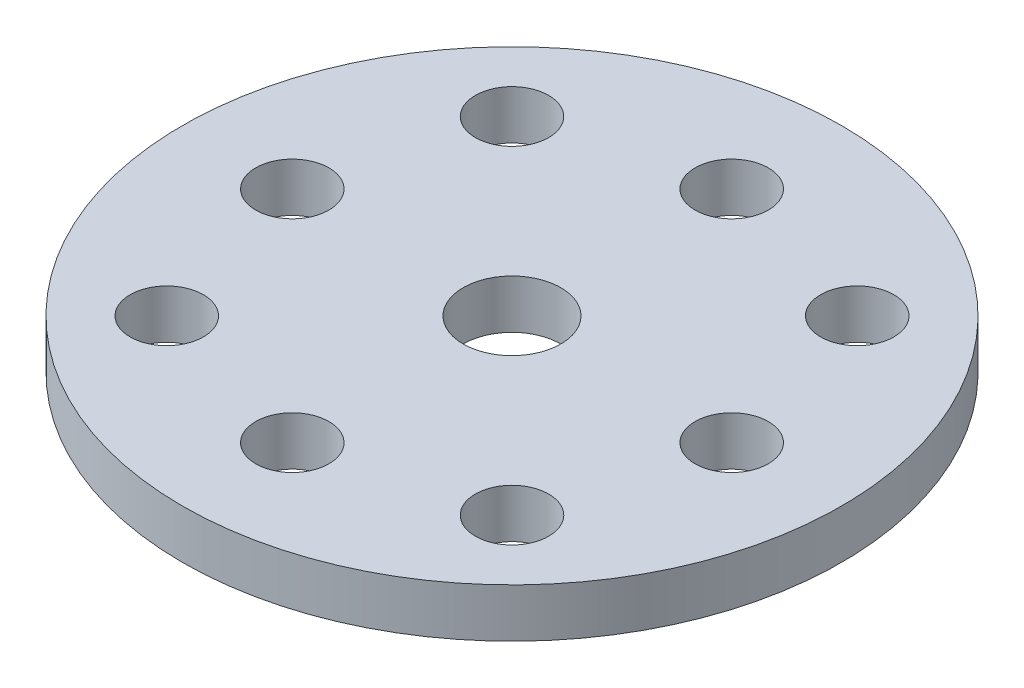
ISO-10303-21;
HEADER;
FILE_DESCRIPTION(('STEP AP214'),'2;1');
FILE_NAME('part.step','',(''),(''),'','','');
FILE_SCHEMA(('AUTOMOTIVE_DESIGN { 1 0 10303 214 1 1 1 1 }'));
ENDSEC;
DATA;
#1=APPLICATION_CONTEXT('core data for automotive mechanical design processes');
#2=APPLICATION_PROTOCOL_DEFINITION('international standard','automotive_design',2000,#1);
#3=PRODUCT_CONTEXT('',#1,'mechanical');
#4=PRODUCT('Part','Part','',(#3));
#5=PRODUCT_RELATED_PRODUCT_CATEGORY('part','',(#4));
#6=PRODUCT_DEFINITION_FORMATION('','',#4);
#7=PRODUCT_DEFINITION_CONTEXT('part definition',#1,'design');
#8=PRODUCT_DEFINITION('design','',#6,#7);
#9=PRODUCT_DEFINITION_SHAPE('','',#8);
#10=(LENGTH_UNIT() NAMED_UNIT(*) SI_UNIT(.MILLI.,.METRE.));
#11=(NAMED_UNIT(*) PLANE_ANGLE_UNIT() SI_UNIT($,.RADIAN.));
#12=(NAMED_UNIT(*) SI_UNIT($,.STERADIAN.) SOLID_ANGLE_UNIT());
#13=UNCERTAINTY_MEASURE_WITH_UNIT(LENGTH_MEASURE(1.E-05),#10,'distance_accuracy_value','');
#14=(GEOMETRIC_REPRESENTATION_CONTEXT(3) GLOBAL_UNCERTAINTY_ASSIGNED_CONTEXT((#13)) GLOBAL_UNIT_ASSIGNED_CONTEXT((#10,
#11,#12)) REPRESENTATION_CONTEXT('',''));
#15=CARTESIAN_POINT('',(0.,0.,0.));
#16=DIRECTION('',(0.,0.,1.));
#17=DIRECTION('',(1.,0.,0.));
#18=AXIS2_PLACEMENT_3D('',#15,#16,#17);
#19=CARTESIAN_POINT('',(0.,2.,0.));
#20=DIRECTION('',(0.,-1.,0.));
#21=DIRECTION('',(0.,0.,-1.));
#22=AXIS2_PLACEMENT_3D('',#19,#20,#21);
#23=CYLINDRICAL_SURFACE('',#22,13.5);
#24=CARTESIAN_POINT('',(0.,2.,0.));
#25=DIRECTION('',(0.,1.,0.));
#26=DIRECTION('',(0.,0.,1.));
#27=AXIS2_PLACEMENT_3D('',#24,#25,#26);
#28=CIRCLE('',#27,13.5);
#29=CARTESIAN_POINT('',(0.,2.,13.5));
#30=VERTEX_POINT('',#29);
#31=EDGE_CURVE('E10',#30,#30,#28,.T.);
#32=ORIENTED_EDGE('',*,*,#31,.F.);
#33=EDGE_LOOP('',(#32));
#34=FACE_BOUND('',#33,.T.);
#35=CARTESIAN_POINT('',(0.,0.,0.));
#36=DIRECTION('',(0.,1.,0.));
#37=DIRECTION('',(0.,0.,1.));
#38=AXIS2_PLACEMENT_3D('',#35,#36,#37);
#39=CIRCLE('',#38,13.5);
#40=CARTESIAN_POINT('',(0.,0.,13.5));
#41=VERTEX_POINT('',#40);
#42=EDGE_CURVE('E36',#41,#41,#39,.T.);
#43=ORIENTED_EDGE('',*,*,#42,.T.);
#44=EDGE_LOOP('',(#43));
#45=FACE_BOUND('',#44,.T.);
#46=ADVANCED_FACE('F33',(#34,#45),#23,.T.);
#47=CARTESIAN_POINT('',(0.,2.,0.));
#48=DIRECTION('',(0.,1.,0.));
#49=DIRECTION('',(0.,0.,1.));
#50=AXIS2_PLACEMENT_3D('',#47,#48,#49);
#51=PLANE('',#50);
#52=CARTESIAN_POINT('',(0.,2.,0.));
#53=DIRECTION('',(0.,1.,0.));
#54=DIRECTION('',(0.,0.,1.));
#55=AXIS2_PLACEMENT_3D('',#52,#53,#54);
#56=CIRCLE('',#55,2.);
#57=CARTESIAN_POINT('',(0.,2.,2.));
#58=VERTEX_POINT('',#57);
#59=EDGE_CURVE('E93',#58,#58,#56,.T.);
#60=ORIENTED_EDGE('',*,*,#59,.F.);
#61=EDGE_LOOP('',(#60));
#62=FACE_BOUND('',#61,.T.);
#63=CARTESIAN_POINT('',(-7.07106781186556,2.,7.07106781186539));
#64=DIRECTION('',(0.,-1.,0.));
#65=DIRECTION('',(-1.,0.,0.));
#66=AXIS2_PLACEMENT_3D('',#63,#64,#65);
#67=CIRCLE('',#66,1.5);
#68=CARTESIAN_POINT('',(-8.57106781186556,2.,7.07106781186537));
#69=VERTEX_POINT('',#68);
#70=EDGE_CURVE('E78',#69,#69,#67,.T.);
#71=ORIENTED_EDGE('',*,*,#70,.T.);
#72=EDGE_LOOP('',(#71));
#73=FACE_BOUND('',#72,.T.);
#74=CARTESIAN_POINT('',(9.,2.,0.));
#75=DIRECTION('',(0.,-1.,0.));
#76=DIRECTION('',(0.,0.,1.));
#77=AXIS2_PLACEMENT_3D('',#74,#75,#76);
#78=CIRCLE('',#77,1.5);
#79=CARTESIAN_POINT('',(9.,2.,1.5));
#80=VERTEX_POINT('',#79);
#81=EDGE_CURVE('E67',#80,#80,#78,.T.);
#82=ORIENTED_EDGE('',*,*,#81,.T.);
#83=EDGE_LOOP('',(#82));
#84=FACE_BOUND('',#83,.T.);
#85=CARTESIAN_POINT('',(7.07106781186546,2.,7.07106781186549));
#86=DIRECTION('',(0.,-1.,0.));
#87=DIRECTION('',(0.,0.,1.));
#88=AXIS2_PLACEMENT_3D('',#85,#86,#87);
#89=CIRCLE('',#88,1.5);
#90=CARTESIAN_POINT('',(7.07106781186546,2.,8.57106781186549));
#91=VERTEX_POINT('',#90);
#92=EDGE_CURVE('E66',#91,#91,#89,.T.);
#93=ORIENTED_EDGE('',*,*,#92,.T.);
#94=EDGE_LOOP('',(#93));
#95=FACE_BOUND('',#94,.T.);
#96=CARTESIAN_POINT('',(0.,2.,-9.));
#97=DIRECTION('',(0.,-1.,0.));
#98=DIRECTION('',(1.,0.,0.));
#99=AXIS2_PLACEMENT_3D('',#96,#97,#98);
#100=CIRCLE('',#99,1.5);
#101=CARTESIAN_POINT('',(1.50000000000003,2.,-8.99999999999999));
#102=VERTEX_POINT('',#101);
#103=EDGE_CURVE('E60',#102,#102,#100,.T.);
#104=ORIENTED_EDGE('',*,*,#103,.T.);
#105=EDGE_LOOP('',(#104));
#106=FACE_BOUND('',#105,.T.);
#107=CARTESIAN_POINT('',(0.,2.,9.));
#108=DIRECTION('',(0.,-1.,0.));
#109=DIRECTION('',(-1.,0.,0.));
#110=AXIS2_PLACEMENT_3D('',#107,#108,#109);
#111=CIRCLE('',#110,1.5);
#112=CARTESIAN_POINT('',(-1.50000000000009,2.,8.99999999999998));
#113=VERTEX_POINT('',#112);
#114=EDGE_CURVE('E79',#113,#113,#111,.T.);
#115=ORIENTED_EDGE('',*,*,#114,.T.);
#116=EDGE_LOOP('',(#115));
#117=FACE_BOUND('',#116,.T.);
#118=CARTESIAN_POINT('',(7.07106781186551,2.,-7.07106781186544));
#119=DIRECTION('',(0.,-1.,0.));
#120=DIRECTION('',(1.,0.,0.));
#121=AXIS2_PLACEMENT_3D('',#118,#119,#120);
#122=CIRCLE('',#121,1.5);
#123=CARTESIAN_POINT('',(8.57106781186551,2.,-7.07106781186543));
#124=VERTEX_POINT('',#123);
#125=EDGE_CURVE('E49',#124,#124,#122,.T.);
#126=ORIENTED_EDGE('',*,*,#125,.T.);
#127=EDGE_LOOP('',(#126));
#128=FACE_BOUND('',#127,.T.);
#129=CARTESIAN_POINT('',(-7.07106781186546,2.,-7.07106781186549));
#130=DIRECTION('',(0.,-1.,0.));
#131=DIRECTION('',(0.,0.,-1.));
#132=AXIS2_PLACEMENT_3D('',#129,#130,#131);
#133=CIRCLE('',#132,1.5);
#134=CARTESIAN_POINT('',(-7.07106781186546,2.,-8.57106781186549));
#135=VERTEX_POINT('',#134);
#136=EDGE_CURVE('E43',#135,#135,#133,.T.);
#137=ORIENTED_EDGE('',*,*,#136,.T.);
#138=EDGE_LOOP('',(#137));
#139=FACE_BOUND('',#138,.T.);
#140=CARTESIAN_POINT('',(-9.,2.,0.));
#141=DIRECTION('',(0.,-1.,0.));
#142=DIRECTION('',(0.,0.,-1.));
#143=AXIS2_PLACEMENT_3D('',#140,#141,#142);
#144=CIRCLE('',#143,1.5);
#145=CARTESIAN_POINT('',(-9.,2.,-1.5));
#146=VERTEX_POINT('',#145);
#147=EDGE_CURVE('E48',#146,#146,#144,.T.);
#148=ORIENTED_EDGE('',*,*,#147,.T.);
#149=EDGE_LOOP('',(#148));
#150=FACE_BOUND('',#149,.T.);
#151=ORIENTED_EDGE('',*,*,#31,.T.);
#152=EDGE_LOOP('',(#151));
#153=FACE_BOUND('',#152,.T.);
#154=ADVANCED_FACE('F109',(#62,#73,#84,#95,#106,#117,#128,#139,#150,#153),#51,.T.);
#155=CARTESIAN_POINT('',(0.,0.,0.));
#156=DIRECTION('',(0.,1.,0.));
#157=DIRECTION('',(0.,0.,1.));
#158=AXIS2_PLACEMENT_3D('',#155,#156,#157);
#159=PLANE('',#158);
#160=CARTESIAN_POINT('',(0.,0.,0.));
#161=DIRECTION('',(0.,1.,0.));
#162=DIRECTION('',(0.,0.,1.));
#163=AXIS2_PLACEMENT_3D('',#160,#161,#162);
#164=CIRCLE('',#163,2.);
#165=CARTESIAN_POINT('',(0.,0.,2.));
#166=VERTEX_POINT('',#165);
#167=EDGE_CURVE('E90',#166,#166,#164,.T.);
#168=ORIENTED_EDGE('',*,*,#167,.T.);
#169=EDGE_LOOP('',(#168));
#170=FACE_BOUND('',#169,.T.);
#171=CARTESIAN_POINT('',(-7.07106781186556,0.,7.07106781186539));
#172=DIRECTION('',(0.,-1.,0.));
#173=DIRECTION('',(-1.,0.,0.));
#174=AXIS2_PLACEMENT_3D('',#171,#172,#173);
#175=CIRCLE('',#174,1.5);
#176=CARTESIAN_POINT('',(-8.57106781186556,0.,7.07106781186537));
#177=VERTEX_POINT('',#176);
#178=EDGE_CURVE('E75',#177,#177,#175,.T.);
#179=ORIENTED_EDGE('',*,*,#178,.F.);
#180=EDGE_LOOP('',(#179));
#181=FACE_BOUND('',#180,.T.);
#182=CARTESIAN_POINT('',(9.,0.,0.));
#183=DIRECTION('',(0.,-1.,0.));
#184=DIRECTION('',(0.,0.,1.));
#185=AXIS2_PLACEMENT_3D('',#182,#183,#184);
#186=CIRCLE('',#185,1.5);
#187=CARTESIAN_POINT('',(9.,0.,1.5));
#188=VERTEX_POINT('',#187);
#189=EDGE_CURVE('E82',#188,#188,#186,.T.);
#190=ORIENTED_EDGE('',*,*,#189,.F.);
#191=EDGE_LOOP('',(#190));
#192=FACE_BOUND('',#191,.T.);
#193=CARTESIAN_POINT('',(7.07106781186546,0.,7.07106781186549));
#194=DIRECTION('',(0.,-1.,0.));
#195=DIRECTION('',(0.,0.,1.));
#196=AXIS2_PLACEMENT_3D('',#193,#194,#195);
#197=CIRCLE('',#196,1.5);
#198=CARTESIAN_POINT('',(7.07106781186546,0.,8.57106781186549));
#199=VERTEX_POINT('',#198);
#200=EDGE_CURVE('E63',#199,#199,#197,.T.);
#201=ORIENTED_EDGE('',*,*,#200,.F.);
#202=EDGE_LOOP('',(#201));
#203=FACE_BOUND('',#202,.T.);
#204=CARTESIAN_POINT('',(0.,0.,-9.));
#205=DIRECTION('',(0.,-1.,0.));
#206=DIRECTION('',(1.,0.,0.));
#207=AXIS2_PLACEMENT_3D('',#204,#205,#206);
#208=CIRCLE('',#207,1.5);
#209=CARTESIAN_POINT('',(1.50000000000003,0.,-8.99999999999999));
#210=VERTEX_POINT('',#209);
#211=EDGE_CURVE('E70',#210,#210,#208,.T.);
#212=ORIENTED_EDGE('',*,*,#211,.F.);
#213=EDGE_LOOP('',(#212));
#214=FACE_BOUND('',#213,.T.);
#215=CARTESIAN_POINT('',(0.,0.,9.));
#216=DIRECTION('',(0.,-1.,0.));
#217=DIRECTION('',(-1.,0.,0.));
#218=AXIS2_PLACEMENT_3D('',#215,#216,#217);
#219=CIRCLE('',#218,1.5);
#220=CARTESIAN_POINT('',(-1.50000000000009,0.,8.99999999999998));
#221=VERTEX_POINT('',#220);
#222=EDGE_CURVE('E87',#221,#221,#219,.T.);
#223=ORIENTED_EDGE('',*,*,#222,.F.);
#224=EDGE_LOOP('',(#223));
#225=FACE_BOUND('',#224,.T.);
#226=CARTESIAN_POINT('',(7.07106781186551,0.,-7.07106781186544));
#227=DIRECTION('',(0.,-1.,0.));
#228=DIRECTION('',(1.,0.,0.));
#229=AXIS2_PLACEMENT_3D('',#226,#227,#228);
#230=CIRCLE('',#229,1.5);
#231=CARTESIAN_POINT('',(8.57106781186551,0.,-7.07106781186543));
#232=VERTEX_POINT('',#231);
#233=EDGE_CURVE('E57',#232,#232,#230,.T.);
#234=ORIENTED_EDGE('',*,*,#233,.F.);
#235=EDGE_LOOP('',(#234));
#236=FACE_BOUND('',#235,.T.);
#237=CARTESIAN_POINT('',(-7.07106781186546,0.,-7.07106781186549));
#238=DIRECTION('',(0.,-1.,0.));
#239=DIRECTION('',(0.,0.,-1.));
#240=AXIS2_PLACEMENT_3D('',#237,#238,#239);
#241=CIRCLE('',#240,1.5);
#242=CARTESIAN_POINT('',(-7.07106781186546,0.,-8.57106781186549));
#243=VERTEX_POINT('',#242);
#244=EDGE_CURVE('E52',#243,#243,#241,.T.);
#245=ORIENTED_EDGE('',*,*,#244,.F.);
#246=EDGE_LOOP('',(#245));
#247=FACE_BOUND('',#246,.T.);
#248=CARTESIAN_POINT('',(-9.,0.,0.));
#249=DIRECTION('',(0.,-1.,0.));
#250=DIRECTION('',(0.,0.,-1.));
#251=AXIS2_PLACEMENT_3D('',#248,#249,#250);
#252=CIRCLE('',#251,1.5);
#253=CARTESIAN_POINT('',(-9.,0.,-1.5));
#254=VERTEX_POINT('',#253);
#255=EDGE_CURVE('E45',#254,#254,#252,.T.);
#256=ORIENTED_EDGE('',*,*,#255,.F.);
#257=EDGE_LOOP('',(#256));
#258=FACE_BOUND('',#257,.T.);
#259=ORIENTED_EDGE('',*,*,#42,.F.);
#260=EDGE_LOOP('',(#259));
#261=FACE_BOUND('',#260,.T.);
#262=ADVANCED_FACE('F99',(#170,#181,#192,#203,#214,#225,#236,#247,#258,#261),#159,.F.);
#263=CARTESIAN_POINT('',(-9.,2.,0.));
#264=DIRECTION('',(0.,-1.,0.));
#265=DIRECTION('',(0.,0.,-1.));
#266=AXIS2_PLACEMENT_3D('',#263,#264,#265);
#267=CYLINDRICAL_SURFACE('',#266,1.5);
#268=ORIENTED_EDGE('',*,*,#147,.F.);
#269=EDGE_LOOP('',(#268));
#270=FACE_BOUND('',#269,.T.);
#271=ORIENTED_EDGE('',*,*,#255,.T.);
#272=EDGE_LOOP('',(#271));
#273=FACE_BOUND('',#272,.T.);
#274=ADVANCED_FACE('F129',(#270,#273),#267,.F.);
#275=CARTESIAN_POINT('',(-7.07106781186546,2.,-7.07106781186549));
#276=DIRECTION('',(0.,-1.,0.));
#277=DIRECTION('',(0.,0.,-1.));
#278=AXIS2_PLACEMENT_3D('',#275,#276,#277);
#279=CYLINDRICAL_SURFACE('',#278,1.5);
#280=ORIENTED_EDGE('',*,*,#136,.F.);
#281=EDGE_LOOP('',(#280));
#282=FACE_BOUND('',#281,.T.);
#283=ORIENTED_EDGE('',*,*,#244,.T.);
#284=EDGE_LOOP('',(#283));
#285=FACE_BOUND('',#284,.T.);
#286=ADVANCED_FACE('F132',(#282,#285),#279,.F.);
#287=CARTESIAN_POINT('',(7.07106781186551,2.,-7.07106781186544));
#288=DIRECTION('',(0.,-1.,0.));
#289=DIRECTION('',(0.,0.,-1.));
#290=AXIS2_PLACEMENT_3D('',#287,#288,#289);
#291=CYLINDRICAL_SURFACE('',#290,1.5);
#292=ORIENTED_EDGE('',*,*,#125,.F.);
#293=EDGE_LOOP('',(#292));
#294=FACE_BOUND('',#293,.T.);
#295=ORIENTED_EDGE('',*,*,#233,.T.);
#296=EDGE_LOOP('',(#295));
#297=FACE_BOUND('',#296,.T.);
#298=ADVANCED_FACE('F164',(#294,#297),#291,.F.);
#299=CARTESIAN_POINT('',(0.,2.,9.));
#300=DIRECTION('',(0.,-1.,0.));
#301=DIRECTION('',(0.,0.,-1.));
#302=AXIS2_PLACEMENT_3D('',#299,#300,#301);
#303=CYLINDRICAL_SURFACE('',#302,1.5);
#304=ORIENTED_EDGE('',*,*,#114,.F.);
#305=EDGE_LOOP('',(#304));
#306=FACE_BOUND('',#305,.T.);
#307=ORIENTED_EDGE('',*,*,#222,.T.);
#308=EDGE_LOOP('',(#307));
#309=FACE_BOUND('',#308,.T.);
#310=ADVANCED_FACE('F172',(#306,#309),#303,.F.);
#311=CARTESIAN_POINT('',(0.,2.,-9.));
#312=DIRECTION('',(0.,-1.,0.));
#313=DIRECTION('',(0.,0.,-1.));
#314=AXIS2_PLACEMENT_3D('',#311,#312,#313);
#315=CYLINDRICAL_SURFACE('',#314,1.5);
#316=ORIENTED_EDGE('',*,*,#103,.F.);
#317=EDGE_LOOP('',(#316));
#318=FACE_BOUND('',#317,.T.);
#319=ORIENTED_EDGE('',*,*,#211,.T.);
#320=EDGE_LOOP('',(#319));
#321=FACE_BOUND('',#320,.T.);
#322=ADVANCED_FACE('F180',(#318,#321),#315,.F.);
#323=CARTESIAN_POINT('',(7.07106781186546,2.,7.07106781186549));
#324=DIRECTION('',(0.,-1.,0.));
#325=DIRECTION('',(0.,0.,-1.));
#326=AXIS2_PLACEMENT_3D('',#323,#324,#325);
#327=CYLINDRICAL_SURFACE('',#326,1.5);
#328=ORIENTED_EDGE('',*,*,#92,.F.);
#329=EDGE_LOOP('',(#328));
#330=FACE_BOUND('',#329,.T.);
#331=ORIENTED_EDGE('',*,*,#200,.T.);
#332=EDGE_LOOP('',(#331));
#333=FACE_BOUND('',#332,.T.);
#334=ADVANCED_FACE('F188',(#330,#333),#327,.F.);
#335=CARTESIAN_POINT('',(9.,2.,0.));
#336=DIRECTION('',(0.,-1.,0.));
#337=DIRECTION('',(0.,0.,-1.));
#338=AXIS2_PLACEMENT_3D('',#335,#336,#337);
#339=CYLINDRICAL_SURFACE('',#338,1.5);
#340=ORIENTED_EDGE('',*,*,#81,.F.);
#341=EDGE_LOOP('',(#340));
#342=FACE_BOUND('',#341,.T.);
#343=ORIENTED_EDGE('',*,*,#189,.T.);
#344=EDGE_LOOP('',(#343));
#345=FACE_BOUND('',#344,.T.);
#346=ADVANCED_FACE('F196',(#342,#345),#339,.F.);
#347=CARTESIAN_POINT('',(-7.07106781186556,2.,7.07106781186539));
#348=DIRECTION('',(0.,-1.,0.));
#349=DIRECTION('',(0.,0.,-1.));
#350=AXIS2_PLACEMENT_3D('',#347,#348,#349);
#351=CYLINDRICAL_SURFACE('',#350,1.5);
#352=ORIENTED_EDGE('',*,*,#70,.F.);
#353=EDGE_LOOP('',(#352));
#354=FACE_BOUND('',#353,.T.);
#355=ORIENTED_EDGE('',*,*,#178,.T.);
#356=EDGE_LOOP('',(#355));
#357=FACE_BOUND('',#356,.T.);
#358=ADVANCED_FACE('F105',(#354,#357),#351,.F.);
#359=CARTESIAN_POINT('',(0.,0.,0.));
#360=DIRECTION('',(0.,1.,0.));
#361=DIRECTION('',(0.,0.,1.));
#362=AXIS2_PLACEMENT_3D('',#359,#360,#361);
#363=CYLINDRICAL_SURFACE('',#362,2.);
#364=ORIENTED_EDGE('',*,*,#167,.F.);
#365=EDGE_LOOP('',(#364));
#366=FACE_BOUND('',#365,.T.);
#367=ORIENTED_EDGE('',*,*,#59,.T.);
#368=EDGE_LOOP('',(#367));
#369=FACE_BOUND('',#368,.T.);
#370=ADVANCED_FACE('F102',(#366,#369),#363,.F.);
#371=CLOSED_SHELL('',(#46,#154,#262,#274,#286,#298,#310,#322,#334,#346,#358,#370));
#372=MANIFOLD_SOLID_BREP('B2',#371);
#373=ADVANCED_BREP_SHAPE_REPRESENTATION('',(#18,#372),#14);
#374=SHAPE_DEFINITION_REPRESENTATION(#9,#373);
ENDSEC;
END-ISO-10303-21;
